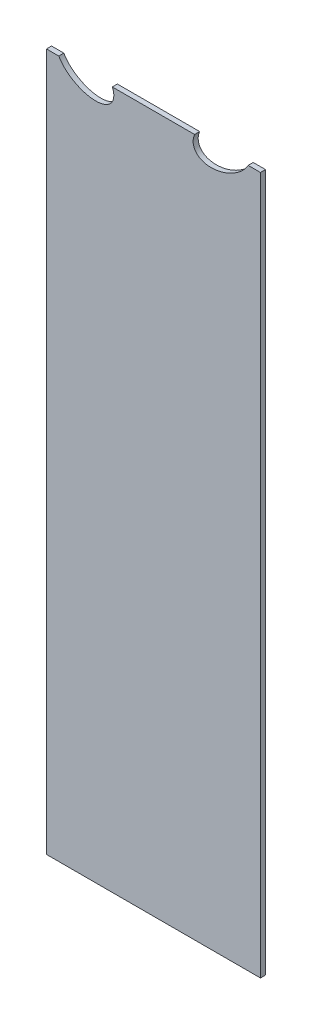
ISO-10303-21;
HEADER;
FILE_DESCRIPTION(('STEP AP214'),'2;1');
FILE_NAME('part.step','',(''),(''),'','','');
FILE_SCHEMA(('AUTOMOTIVE_DESIGN { 1 0 10303 214 1 1 1 1 }'));
ENDSEC;
DATA;
#1=APPLICATION_CONTEXT('core data for automotive mechanical design processes');
#2=APPLICATION_PROTOCOL_DEFINITION('international standard','automotive_design',2000,#1);
#3=PRODUCT_CONTEXT('',#1,'mechanical');
#4=PRODUCT('Part','Part','',(#3));
#5=PRODUCT_RELATED_PRODUCT_CATEGORY('part','',(#4));
#6=PRODUCT_DEFINITION_FORMATION('','',#4);
#7=PRODUCT_DEFINITION_CONTEXT('part definition',#1,'design');
#8=PRODUCT_DEFINITION('design','',#6,#7);
#9=PRODUCT_DEFINITION_SHAPE('','',#8);
#10=(LENGTH_UNIT() NAMED_UNIT(*) SI_UNIT(.MILLI.,.METRE.));
#11=(NAMED_UNIT(*) PLANE_ANGLE_UNIT() SI_UNIT($,.RADIAN.));
#12=(NAMED_UNIT(*) SI_UNIT($,.STERADIAN.) SOLID_ANGLE_UNIT());
#13=UNCERTAINTY_MEASURE_WITH_UNIT(LENGTH_MEASURE(1.E-05),#10,'distance_accuracy_value','');
#14=(GEOMETRIC_REPRESENTATION_CONTEXT(3) GLOBAL_UNCERTAINTY_ASSIGNED_CONTEXT((#13)) GLOBAL_UNIT_ASSIGNED_CONTEXT((#10,
#11,#12)) REPRESENTATION_CONTEXT('',''));
#15=CARTESIAN_POINT('',(0.,0.,0.));
#16=DIRECTION('',(0.,0.,1.));
#17=DIRECTION('',(1.,0.,0.));
#18=AXIS2_PLACEMENT_3D('',#15,#16,#17);
#19=CARTESIAN_POINT('',(0.,0.,3.));
#20=DIRECTION('',(0.,0.,1.));
#21=DIRECTION('',(1.,0.,0.));
#22=AXIS2_PLACEMENT_3D('',#19,#20,#21);
#23=PLANE('',#22);
#24=DIRECTION('',(1.,0.,0.));
#25=VECTOR('',#24,1.);
#26=CARTESIAN_POINT('',(-63.5000000000002,414.02,3.));
#27=LINE('',#26,#25);
#28=CARTESIAN_POINT('',(-63.5000000000002,414.02,3.));
#29=VERTEX_POINT('',#28);
#30=CARTESIAN_POINT('',(-56.1960605772913,414.020000016292,3.));
#31=VERTEX_POINT('',#30);
#32=EDGE_CURVE('E55',#29,#31,#27,.T.);
#33=ORIENTED_EDGE('',*,*,#32,.F.);
#34=DIRECTION('',(0.,-1.,0.));
#35=VECTOR('',#34,1.);
#36=CARTESIAN_POINT('',(-63.5000000000002,508.,3.));
#37=LINE('',#36,#35);
#38=CARTESIAN_POINT('',(-63.5,0.,3.));
#39=VERTEX_POINT('',#38);
#40=EDGE_CURVE('E119',#29,#39,#37,.T.);
#41=ORIENTED_EDGE('',*,*,#40,.T.);
#42=DIRECTION('',(1.,0.,0.));
#43=VECTOR('',#42,1.);
#44=CARTESIAN_POINT('',(-63.5,0.,3.));
#45=LINE('',#44,#43);
#46=CARTESIAN_POINT('',(63.5,0.,3.));
#47=VERTEX_POINT('',#46);
#48=EDGE_CURVE('E211',#39,#47,#45,.T.);
#49=ORIENTED_EDGE('',*,*,#48,.T.);
#50=DIRECTION('',(0.,1.,0.));
#51=VECTOR('',#50,1.);
#52=CARTESIAN_POINT('',(63.5,0.,3.));
#53=LINE('',#52,#51);
#54=CARTESIAN_POINT('',(63.5,414.02,3.));
#55=VERTEX_POINT('',#54);
#56=EDGE_CURVE('E138',#47,#55,#53,.T.);
#57=ORIENTED_EDGE('',*,*,#56,.T.);
#58=CARTESIAN_POINT('',(56.1960605693802,414.02,3.));
#59=VERTEX_POINT('',#58);
#60=EDGE_CURVE('E153',#59,#55,#27,.T.);
#61=ORIENTED_EDGE('',*,*,#60,.F.);
#62=CARTESIAN_POINT('',(56.9541679709941,422.401741295347,3.));
#63=CARTESIAN_POINT('',(56.7262102010793,422.880704679116,3.));
#64=CARTESIAN_POINT('',(56.1701392690844,423.790963502471,3.));
#65=CARTESIAN_POINT('',(54.8383847625562,425.134120987692,3.));
#66=CARTESIAN_POINT('',(52.9694857750021,426.269720281365,3.));
#67=CARTESIAN_POINT('',(49.7001726468081,427.360376803217,3.));
#68=CARTESIAN_POINT('',(44.0531130415893,427.587605353852,3.));
#69=CARTESIAN_POINT('',(35.6354031349301,425.052654422899,3.));
#70=CARTESIAN_POINT('',(28.3595999127005,420.118436778085,3.));
#71=CARTESIAN_POINT('',(24.9747349095251,415.592555216511,3.));
#72=CARTESIAN_POINT('',(23.7594428288344,412.367496281011,3.));
#73=CARTESIAN_POINT('',(23.4621751763721,410.200931921415,3.));
#74=CARTESIAN_POINT('',(23.6647299788258,408.320343277461,3.));
#75=CARTESIAN_POINT('',(24.198370200322,406.811951209881,3.));
#76=CARTESIAN_POINT('',(25.0324765983145,405.446562974848,3.));
#77=CARTESIAN_POINT('',(26.3642311048427,404.103405489627,3.));
#78=CARTESIAN_POINT('',(28.2331300923967,402.967806195954,3.));
#79=CARTESIAN_POINT('',(31.5024432205908,401.877149674101,3.));
#80=CARTESIAN_POINT('',(37.1495028258096,401.649921123467,3.));
#81=CARTESIAN_POINT('',(45.5672127324687,404.184872054419,3.));
#82=CARTESIAN_POINT('',(52.8430159546984,409.119089699234,3.));
#83=CARTESIAN_POINT('',(56.2278809578737,413.644971260808,3.));
#84=CARTESIAN_POINT('',(57.4431730385644,416.870030196308,3.));
#85=CARTESIAN_POINT('',(57.7404406910268,419.036594555904,3.));
#86=CARTESIAN_POINT('',(57.5378858885731,420.917183199858,3.));
#87=CARTESIAN_POINT('',(57.1821257409089,421.922777911578,3.));
#88=CARTESIAN_POINT('',(56.9541679709941,422.401741295347,3.));
#89=B_SPLINE_CURVE_WITH_KNOTS('',3,(#62,#63,#64,#65,#66,#67,#68,#69,#70,#71,#72,#73,#74,#75,#76,
#77,#78,#79,#80,#81,#82,#83,#84,#85,#86,#87,#88),.UNSPECIFIED.,.T.,.F.,(4,1,1,1,1,1,1,1,1,1,1,1,
1,1,1,1,1,1,1,1,1,1,1,1,4),(0.,0.03125,0.0625,0.09375,0.125,0.1875,0.25,0.3125,0.375,0.40625,
0.4375,0.46875,0.5,0.53125,0.5625,0.59375,0.625,0.6875,0.75,0.8125,0.875,0.90625,0.9375,0.96875,
1.),.UNSPECIFIED.);
#90=CARTESIAN_POINT('',(24.4199807768893,414.019999991949,3.));
#91=VERTEX_POINT('',#90);
#92=EDGE_CURVE('E163',#91,#59,#89,.T.);
#93=ORIENTED_EDGE('',*,*,#92,.F.);
#94=CARTESIAN_POINT('',(-24.4199807803433,414.02,3.));
#95=VERTEX_POINT('',#94);
#96=EDGE_CURVE('E166',#95,#91,#27,.T.);
#97=ORIENTED_EDGE('',*,*,#96,.F.);
#98=CARTESIAN_POINT('',(-24.2484478964048,406.835785181972,3.));
#99=CARTESIAN_POINT('',(-24.02049012649,407.314748565741,3.));
#100=CARTESIAN_POINT('',(-23.6647299788258,408.320343277462,3.));
#101=CARTESIAN_POINT('',(-23.4621751763721,410.200931921415,3.));
#102=CARTESIAN_POINT('',(-23.7594428288345,412.367496281011,3.));
#103=CARTESIAN_POINT('',(-24.9747349095252,415.592555216511,3.));
#104=CARTESIAN_POINT('',(-28.3595999127005,420.118436778085,3.));
#105=CARTESIAN_POINT('',(-35.6354031349302,425.0526544229,3.));
#106=CARTESIAN_POINT('',(-44.0531130415893,427.587605353852,3.));
#107=CARTESIAN_POINT('',(-49.7001726468081,427.360376803217,3.));
#108=CARTESIAN_POINT('',(-52.9694857750022,426.269720281365,3.));
#109=CARTESIAN_POINT('',(-54.8383847625562,425.134120987693,3.));
#110=CARTESIAN_POINT('',(-56.1701392690844,423.790963502471,3.));
#111=CARTESIAN_POINT('',(-57.0042456670769,422.425575267438,3.));
#112=CARTESIAN_POINT('',(-57.5378858885731,420.917183199858,3.));
#113=CARTESIAN_POINT('',(-57.7404406910269,419.036594555904,3.));
#114=CARTESIAN_POINT('',(-57.4431730385645,416.870030196308,3.));
#115=CARTESIAN_POINT('',(-56.2278809578738,413.644971260808,3.));
#116=CARTESIAN_POINT('',(-52.8430159546984,409.119089699234,3.));
#117=CARTESIAN_POINT('',(-45.5672127324688,404.184872054419,3.));
#118=CARTESIAN_POINT('',(-37.1495028258096,401.649921123467,3.));
#119=CARTESIAN_POINT('',(-31.5024432205909,401.877149674102,3.));
#120=CARTESIAN_POINT('',(-28.2331300923967,402.967806195954,3.));
#121=CARTESIAN_POINT('',(-26.3642311048428,404.103405489627,3.));
#122=CARTESIAN_POINT('',(-25.0324765983145,405.446562974848,3.));
#123=CARTESIAN_POINT('',(-24.4764056663196,406.356821798203,3.));
#124=CARTESIAN_POINT('',(-24.2484478964048,406.835785181972,3.));
#125=B_SPLINE_CURVE_WITH_KNOTS('',3,(#98,#99,#100,#101,#102,#103,#104,#105,#106,#107,#108,#109,
#110,#111,#112,#113,#114,#115,#116,#117,#118,#119,#120,#121,#122,#123,#124),.UNSPECIFIED.,.T.,
.F.,(4,1,1,1,1,1,1,1,1,1,1,1,1,1,1,1,1,1,1,1,1,1,1,1,4),(0.,0.03125,0.0625,0.09375,0.125,0.1875,
0.25,0.3125,0.375,0.40625,0.4375,0.46875,0.5,0.53125,0.5625,0.59375,0.625,0.6875,0.75,0.8125,
0.875,0.90625,0.9375,0.96875,1.),.UNSPECIFIED.);
#126=EDGE_CURVE('E128',#31,#95,#125,.T.);
#127=ORIENTED_EDGE('',*,*,#126,.F.);
#128=EDGE_LOOP('',(#33,#41,#49,#57,#61,#93,#97,#127));
#129=FACE_BOUND('',#128,.T.);
#130=ADVANCED_FACE('F39',(#129),#23,.T.);
#131=CARTESIAN_POINT('',(0.,0.,0.));
#132=DIRECTION('',(0.,0.,1.));
#133=DIRECTION('',(1.,0.,0.));
#134=AXIS2_PLACEMENT_3D('',#131,#132,#133);
#135=PLANE('',#134);
#136=DIRECTION('',(0.,-1.,0.));
#137=VECTOR('',#136,1.);
#138=CARTESIAN_POINT('',(-63.5000000000002,508.,0.));
#139=LINE('',#138,#137);
#140=CARTESIAN_POINT('',(-63.5000000000002,414.02,0.));
#141=VERTEX_POINT('',#140);
#142=CARTESIAN_POINT('',(-63.5,0.,0.));
#143=VERTEX_POINT('',#142);
#144=EDGE_CURVE('E117',#141,#143,#139,.T.);
#145=ORIENTED_EDGE('',*,*,#144,.F.);
#146=DIRECTION('',(1.,0.,0.));
#147=VECTOR('',#146,1.);
#148=CARTESIAN_POINT('',(-63.5000000000002,414.02,0.));
#149=LINE('',#148,#147);
#150=CARTESIAN_POINT('',(-56.1960605772913,414.02,0.));
#151=VERTEX_POINT('',#150);
#152=EDGE_CURVE('E102',#141,#151,#149,.T.);
#153=ORIENTED_EDGE('',*,*,#152,.T.);
#154=CARTESIAN_POINT('',(-24.2484478964048,406.835785181972,0.));
#155=CARTESIAN_POINT('',(-24.02049012649,407.314748565741,0.));
#156=CARTESIAN_POINT('',(-23.6647299788258,408.320343277462,0.));
#157=CARTESIAN_POINT('',(-23.4621751763721,410.200931921415,0.));
#158=CARTESIAN_POINT('',(-23.7594428288345,412.367496281011,0.));
#159=CARTESIAN_POINT('',(-24.9747349095252,415.592555216511,0.));
#160=CARTESIAN_POINT('',(-28.3595999127005,420.118436778085,0.));
#161=CARTESIAN_POINT('',(-35.6354031349302,425.0526544229,0.));
#162=CARTESIAN_POINT('',(-44.0531130415893,427.587605353852,0.));
#163=CARTESIAN_POINT('',(-49.7001726468081,427.360376803217,0.));
#164=CARTESIAN_POINT('',(-52.9694857750022,426.269720281365,0.));
#165=CARTESIAN_POINT('',(-54.8383847625562,425.134120987693,0.));
#166=CARTESIAN_POINT('',(-56.1701392690844,423.790963502471,0.));
#167=CARTESIAN_POINT('',(-57.0042456670769,422.425575267438,0.));
#168=CARTESIAN_POINT('',(-57.5378858885731,420.917183199858,0.));
#169=CARTESIAN_POINT('',(-57.7404406910269,419.036594555904,0.));
#170=CARTESIAN_POINT('',(-57.4431730385645,416.870030196308,0.));
#171=CARTESIAN_POINT('',(-56.2278809578738,413.644971260808,0.));
#172=CARTESIAN_POINT('',(-52.8430159546984,409.119089699234,0.));
#173=CARTESIAN_POINT('',(-45.5672127324688,404.184872054419,0.));
#174=CARTESIAN_POINT('',(-37.1495028258096,401.649921123467,0.));
#175=CARTESIAN_POINT('',(-31.5024432205909,401.877149674102,0.));
#176=CARTESIAN_POINT('',(-28.2331300923967,402.967806195954,0.));
#177=CARTESIAN_POINT('',(-26.3642311048428,404.103405489627,0.));
#178=CARTESIAN_POINT('',(-25.0324765983145,405.446562974848,0.));
#179=CARTESIAN_POINT('',(-24.4764056663196,406.356821798203,0.));
#180=CARTESIAN_POINT('',(-24.2484478964048,406.835785181972,0.));
#181=B_SPLINE_CURVE_WITH_KNOTS('',3,(#154,#155,#156,#157,#158,#159,#160,#161,#162,#163,#164,
#165,#166,#167,#168,#169,#170,#171,#172,#173,#174,#175,#176,#177,#178,#179,#180),.UNSPECIFIED.,
.T.,.F.,(4,1,1,1,1,1,1,1,1,1,1,1,1,1,1,1,1,1,1,1,1,1,1,1,4),(0.,0.03125,0.0625,0.09375,0.125,
0.1875,0.25,0.3125,0.375,0.40625,0.4375,0.46875,0.5,0.53125,0.5625,0.59375,0.625,0.6875,0.75,
0.8125,0.875,0.90625,0.9375,0.96875,1.),.UNSPECIFIED.);
#182=CARTESIAN_POINT('',(-24.4199807803433,414.02,0.));
#183=VERTEX_POINT('',#182);
#184=EDGE_CURVE('E135',#151,#183,#181,.T.);
#185=ORIENTED_EDGE('',*,*,#184,.T.);
#186=CARTESIAN_POINT('',(24.4199807768893,414.02,0.));
#187=VERTEX_POINT('',#186);
#188=EDGE_CURVE('E112',#183,#187,#149,.T.);
#189=ORIENTED_EDGE('',*,*,#188,.T.);
#190=CARTESIAN_POINT('',(56.9541679709941,422.401741295347,0.));
#191=CARTESIAN_POINT('',(56.7262102010793,422.880704679116,0.));
#192=CARTESIAN_POINT('',(56.1701392690844,423.790963502471,0.));
#193=CARTESIAN_POINT('',(54.8383847625562,425.134120987692,0.));
#194=CARTESIAN_POINT('',(52.9694857750021,426.269720281365,0.));
#195=CARTESIAN_POINT('',(49.7001726468081,427.360376803217,0.));
#196=CARTESIAN_POINT('',(44.0531130415893,427.587605353852,0.));
#197=CARTESIAN_POINT('',(35.6354031349301,425.052654422899,0.));
#198=CARTESIAN_POINT('',(28.3595999127005,420.118436778085,0.));
#199=CARTESIAN_POINT('',(24.9747349095251,415.592555216511,0.));
#200=CARTESIAN_POINT('',(23.7594428288344,412.367496281011,0.));
#201=CARTESIAN_POINT('',(23.4621751763721,410.200931921415,0.));
#202=CARTESIAN_POINT('',(23.6647299788258,408.320343277461,0.));
#203=CARTESIAN_POINT('',(24.198370200322,406.811951209881,0.));
#204=CARTESIAN_POINT('',(25.0324765983145,405.446562974848,0.));
#205=CARTESIAN_POINT('',(26.3642311048427,404.103405489627,0.));
#206=CARTESIAN_POINT('',(28.2331300923967,402.967806195954,0.));
#207=CARTESIAN_POINT('',(31.5024432205908,401.877149674101,0.));
#208=CARTESIAN_POINT('',(37.1495028258096,401.649921123467,0.));
#209=CARTESIAN_POINT('',(45.5672127324687,404.184872054419,0.));
#210=CARTESIAN_POINT('',(52.8430159546984,409.119089699234,0.));
#211=CARTESIAN_POINT('',(56.2278809578737,413.644971260808,0.));
#212=CARTESIAN_POINT('',(57.4431730385644,416.870030196308,0.));
#213=CARTESIAN_POINT('',(57.7404406910268,419.036594555904,0.));
#214=CARTESIAN_POINT('',(57.5378858885731,420.917183199858,0.));
#215=CARTESIAN_POINT('',(57.1821257409089,421.922777911578,0.));
#216=CARTESIAN_POINT('',(56.9541679709941,422.401741295347,0.));
#217=B_SPLINE_CURVE_WITH_KNOTS('',3,(#190,#191,#192,#193,#194,#195,#196,#197,#198,#199,#200,
#201,#202,#203,#204,#205,#206,#207,#208,#209,#210,#211,#212,#213,#214,#215,#216),.UNSPECIFIED.,
.T.,.F.,(4,1,1,1,1,1,1,1,1,1,1,1,1,1,1,1,1,1,1,1,1,1,1,1,4),(0.,0.03125,0.0625,0.09375,0.125,
0.1875,0.25,0.3125,0.375,0.40625,0.4375,0.46875,0.5,0.53125,0.5625,0.59375,0.625,0.6875,0.75,
0.8125,0.875,0.90625,0.9375,0.96875,1.),.UNSPECIFIED.);
#218=CARTESIAN_POINT('',(56.1960605693802,414.020000001925,0.));
#219=VERTEX_POINT('',#218);
#220=EDGE_CURVE('E171',#187,#219,#217,.T.);
#221=ORIENTED_EDGE('',*,*,#220,.T.);
#222=CARTESIAN_POINT('',(63.5,414.02,0.));
#223=VERTEX_POINT('',#222);
#224=EDGE_CURVE('E63',#219,#223,#149,.T.);
#225=ORIENTED_EDGE('',*,*,#224,.T.);
#226=DIRECTION('',(0.,1.,0.));
#227=VECTOR('',#226,1.);
#228=CARTESIAN_POINT('',(63.5,0.,0.));
#229=LINE('',#228,#227);
#230=CARTESIAN_POINT('',(63.5,0.,0.));
#231=VERTEX_POINT('',#230);
#232=EDGE_CURVE('E132',#231,#223,#229,.T.);
#233=ORIENTED_EDGE('',*,*,#232,.F.);
#234=DIRECTION('',(1.,0.,0.));
#235=VECTOR('',#234,1.);
#236=CARTESIAN_POINT('',(-63.5,0.,0.));
#237=LINE('',#236,#235);
#238=EDGE_CURVE('E125',#143,#231,#237,.T.);
#239=ORIENTED_EDGE('',*,*,#238,.F.);
#240=EDGE_LOOP('',(#145,#153,#185,#189,#221,#225,#233,#239));
#241=FACE_BOUND('',#240,.T.);
#242=ADVANCED_FACE('F123',(#241),#135,.F.);
#243=CARTESIAN_POINT('',(-63.5000000000002,508.,3.));
#244=DIRECTION('',(1.,0.,0.));
#245=DIRECTION('',(0.,1.,0.));
#246=AXIS2_PLACEMENT_3D('',#243,#244,#245);
#247=PLANE('',#246);
#248=ORIENTED_EDGE('',*,*,#40,.F.);
#249=DIRECTION('',(0.,0.,1.));
#250=VECTOR('',#249,1.);
#251=CARTESIAN_POINT('',(-63.5000000000002,414.02,0.));
#252=LINE('',#251,#250);
#253=EDGE_CURVE('E105',#141,#29,#252,.T.);
#254=ORIENTED_EDGE('',*,*,#253,.F.);
#255=ORIENTED_EDGE('',*,*,#144,.T.);
#256=DIRECTION('',(0.,0.,-1.));
#257=VECTOR('',#256,1.);
#258=CARTESIAN_POINT('',(-63.5,0.,3.));
#259=LINE('',#258,#257);
#260=EDGE_CURVE('E148',#39,#143,#259,.T.);
#261=ORIENTED_EDGE('',*,*,#260,.F.);
#262=EDGE_LOOP('',(#248,#254,#255,#261));
#263=FACE_BOUND('',#262,.T.);
#264=ADVANCED_FACE('F41',(#263),#247,.F.);
#265=CARTESIAN_POINT('',(-63.5,0.,3.));
#266=DIRECTION('',(0.,1.,0.));
#267=DIRECTION('',(-1.,0.,0.));
#268=AXIS2_PLACEMENT_3D('',#265,#266,#267);
#269=PLANE('',#268);
#270=ORIENTED_EDGE('',*,*,#238,.T.);
#271=DIRECTION('',(0.,0.,-1.));
#272=VECTOR('',#271,1.);
#273=CARTESIAN_POINT('',(63.5,0.,3.));
#274=LINE('',#273,#272);
#275=EDGE_CURVE('E144',#47,#231,#274,.T.);
#276=ORIENTED_EDGE('',*,*,#275,.F.);
#277=ORIENTED_EDGE('',*,*,#48,.F.);
#278=ORIENTED_EDGE('',*,*,#260,.T.);
#279=EDGE_LOOP('',(#270,#276,#277,#278));
#280=FACE_BOUND('',#279,.T.);
#281=ADVANCED_FACE('F217',(#280),#269,.F.);
#282=CARTESIAN_POINT('',(63.5,0.,3.));
#283=DIRECTION('',(-1.,0.,0.));
#284=DIRECTION('',(0.,-1.,0.));
#285=AXIS2_PLACEMENT_3D('',#282,#283,#284);
#286=PLANE('',#285);
#287=ORIENTED_EDGE('',*,*,#232,.T.);
#288=DIRECTION('',(0.,0.,1.));
#289=VECTOR('',#288,1.);
#290=CARTESIAN_POINT('',(63.5,414.02,0.));
#291=LINE('',#290,#289);
#292=EDGE_CURVE('E121',#223,#55,#291,.T.);
#293=ORIENTED_EDGE('',*,*,#292,.T.);
#294=ORIENTED_EDGE('',*,*,#56,.F.);
#295=ORIENTED_EDGE('',*,*,#275,.T.);
#296=EDGE_LOOP('',(#287,#293,#294,#295));
#297=FACE_BOUND('',#296,.T.);
#298=ADVANCED_FACE('F195',(#297),#286,.F.);
#299=DIRECTION('',(0.,0.,-1.));
#300=VECTOR('',#299,1.);
#301=SURFACE_OF_LINEAR_EXTRUSION('',#125,#300);
#302=DIRECTION('',(0.,0.,-1.));
#303=VECTOR('',#302,1.);
#304=CARTESIAN_POINT('',(-24.4199807803425,414.02,3.));
#305=LINE('',#304,#303);
#306=EDGE_CURVE('E176',#183,#95,#305,.F.);
#307=ORIENTED_EDGE('',*,*,#306,.F.);
#308=ORIENTED_EDGE('',*,*,#184,.F.);
#309=DIRECTION('',(0.,0.,-1.));
#310=VECTOR('',#309,1.);
#311=CARTESIAN_POINT('',(-56.1960605683205,414.02,3.));
#312=LINE('',#311,#310);
#313=EDGE_CURVE('E106',#31,#151,#312,.T.);
#314=ORIENTED_EDGE('',*,*,#313,.F.);
#315=ORIENTED_EDGE('',*,*,#126,.T.);
#316=EDGE_LOOP('',(#307,#308,#314,#315));
#317=FACE_BOUND('',#316,.T.);
#318=ADVANCED_FACE('F192',(#317),#301,.T.);
#319=DIRECTION('',(0.,0.,-1.));
#320=VECTOR('',#319,1.);
#321=SURFACE_OF_LINEAR_EXTRUSION('',#89,#320);
#322=DIRECTION('',(0.,0.,-1.));
#323=VECTOR('',#322,1.);
#324=CARTESIAN_POINT('',(24.4199807803425,414.02,3.));
#325=LINE('',#324,#323);
#326=EDGE_CURVE('E11',#91,#187,#325,.T.);
#327=ORIENTED_EDGE('',*,*,#326,.F.);
#328=ORIENTED_EDGE('',*,*,#92,.T.);
#329=DIRECTION('',(0.,0.,-1.));
#330=VECTOR('',#329,1.);
#331=CARTESIAN_POINT('',(56.1960605683205,414.02,3.));
#332=LINE('',#331,#330);
#333=EDGE_CURVE('E48',#219,#59,#332,.F.);
#334=ORIENTED_EDGE('',*,*,#333,.F.);
#335=ORIENTED_EDGE('',*,*,#220,.F.);
#336=EDGE_LOOP('',(#327,#328,#334,#335));
#337=FACE_BOUND('',#336,.T.);
#338=ADVANCED_FACE('F169',(#337),#321,.T.);
#339=CARTESIAN_POINT('',(-63.5000000000002,414.02,0.));
#340=DIRECTION('',(0.,-1.,0.));
#341=DIRECTION('',(0.,0.,-1.));
#342=AXIS2_PLACEMENT_3D('',#339,#340,#341);
#343=PLANE('',#342);
#344=ORIENTED_EDGE('',*,*,#333,.T.);
#345=ORIENTED_EDGE('',*,*,#60,.T.);
#346=ORIENTED_EDGE('',*,*,#292,.F.);
#347=ORIENTED_EDGE('',*,*,#224,.F.);
#348=EDGE_LOOP('',(#344,#345,#346,#347));
#349=FACE_BOUND('',#348,.T.);
#350=ADVANCED_FACE('F152',(#349),#343,.F.);
#351=ORIENTED_EDGE('',*,*,#306,.T.);
#352=ORIENTED_EDGE('',*,*,#96,.T.);
#353=ORIENTED_EDGE('',*,*,#326,.T.);
#354=ORIENTED_EDGE('',*,*,#188,.F.);
#355=EDGE_LOOP('',(#351,#352,#353,#354));
#356=FACE_BOUND('',#355,.T.);
#357=ADVANCED_FACE('F226',(#356),#343,.F.);
#358=ORIENTED_EDGE('',*,*,#313,.T.);
#359=ORIENTED_EDGE('',*,*,#152,.F.);
#360=ORIENTED_EDGE('',*,*,#253,.T.);
#361=ORIENTED_EDGE('',*,*,#32,.T.);
#362=EDGE_LOOP('',(#358,#359,#360,#361));
#363=FACE_BOUND('',#362,.T.);
#364=ADVANCED_FACE('F104',(#363),#343,.F.);
#365=CLOSED_SHELL('',(#130,#242,#264,#281,#298,#318,#338,#350,#357,#364));
#366=MANIFOLD_SOLID_BREP('B2',#365);
#367=ADVANCED_BREP_SHAPE_REPRESENTATION('',(#18,#366),#14);
#368=SHAPE_DEFINITION_REPRESENTATION(#9,#367);
ENDSEC;
END-ISO-10303-21;
